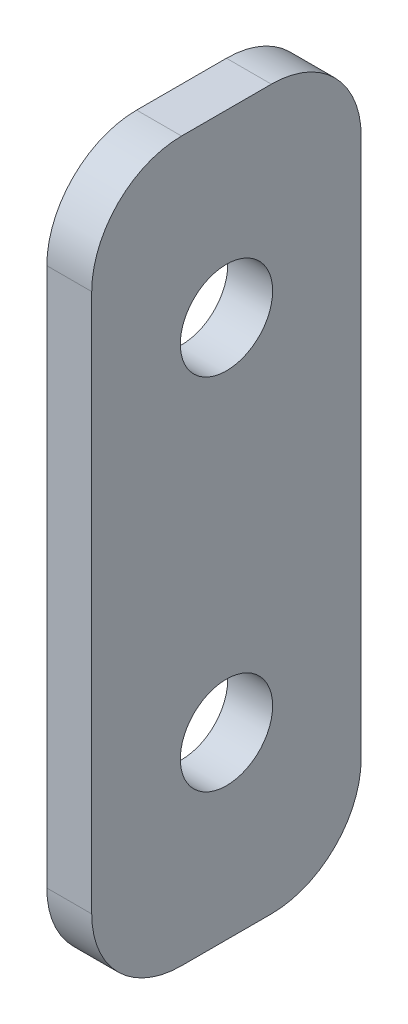
ISO-10303-21;
HEADER;
FILE_DESCRIPTION(('STEP AP214'),'2;1');
FILE_NAME('part.step','',(''),(''),'','','');
FILE_SCHEMA(('AUTOMOTIVE_DESIGN { 1 0 10303 214 1 1 1 1 }'));
ENDSEC;
DATA;
#1=APPLICATION_CONTEXT('core data for automotive mechanical design processes');
#2=APPLICATION_PROTOCOL_DEFINITION('international standard','automotive_design',2000,#1);
#3=PRODUCT_CONTEXT('',#1,'mechanical');
#4=PRODUCT('Part','Part','',(#3));
#5=PRODUCT_RELATED_PRODUCT_CATEGORY('part','',(#4));
#6=PRODUCT_DEFINITION_FORMATION('','',#4);
#7=PRODUCT_DEFINITION_CONTEXT('part definition',#1,'design');
#8=PRODUCT_DEFINITION('design','',#6,#7);
#9=PRODUCT_DEFINITION_SHAPE('','',#8);
#10=(LENGTH_UNIT() NAMED_UNIT(*) SI_UNIT(.MILLI.,.METRE.));
#11=(NAMED_UNIT(*) PLANE_ANGLE_UNIT() SI_UNIT($,.RADIAN.));
#12=(NAMED_UNIT(*) SI_UNIT($,.STERADIAN.) SOLID_ANGLE_UNIT());
#13=UNCERTAINTY_MEASURE_WITH_UNIT(LENGTH_MEASURE(1.E-05),#10,'distance_accuracy_value','');
#14=(GEOMETRIC_REPRESENTATION_CONTEXT(3) GLOBAL_UNCERTAINTY_ASSIGNED_CONTEXT((#13)) GLOBAL_UNIT_ASSIGNED_CONTEXT((#10,
#11,#12)) REPRESENTATION_CONTEXT('',''));
#15=CARTESIAN_POINT('',(0.,0.,0.));
#16=DIRECTION('',(0.,0.,1.));
#17=DIRECTION('',(1.,0.,0.));
#18=AXIS2_PLACEMENT_3D('',#15,#16,#17);
#19=CARTESIAN_POINT('',(1.5875,25.4,-9.525));
#20=DIRECTION('',(0.,0.,1.));
#21=DIRECTION('',(0.,-1.,0.));
#22=AXIS2_PLACEMENT_3D('',#19,#20,#21);
#23=PLANE('',#22);
#24=DIRECTION('',(0.,1.,0.));
#25=VECTOR('',#24,1.);
#26=CARTESIAN_POINT('',(1.5875,25.4,-9.525));
#27=LINE('',#26,#25);
#28=CARTESIAN_POINT('',(1.5875,-19.05,-9.525));
#29=VERTEX_POINT('',#28);
#30=CARTESIAN_POINT('',(1.5875,19.05,-9.525));
#31=VERTEX_POINT('',#30);
#32=EDGE_CURVE('E144',#29,#31,#27,.T.);
#33=ORIENTED_EDGE('',*,*,#32,.F.);
#34=DIRECTION('',(-1.,0.,0.));
#35=VECTOR('',#34,1.);
#36=CARTESIAN_POINT('',(1.5875,-19.05,-9.525));
#37=LINE('',#36,#35);
#38=CARTESIAN_POINT('',(-1.5875,-19.05,-9.525));
#39=VERTEX_POINT('',#38);
#40=EDGE_CURVE('E207',#29,#39,#37,.T.);
#41=ORIENTED_EDGE('',*,*,#40,.T.);
#42=DIRECTION('',(0.,1.,0.));
#43=VECTOR('',#42,1.);
#44=CARTESIAN_POINT('',(-1.5875,25.4,-9.525));
#45=LINE('',#44,#43);
#46=CARTESIAN_POINT('',(-1.5875,19.05,-9.525));
#47=VERTEX_POINT('',#46);
#48=EDGE_CURVE('E221',#39,#47,#45,.T.);
#49=ORIENTED_EDGE('',*,*,#48,.T.);
#50=DIRECTION('',(-1.,0.,0.));
#51=VECTOR('',#50,1.);
#52=CARTESIAN_POINT('',(1.5875,19.05,-9.525));
#53=LINE('',#52,#51);
#54=EDGE_CURVE('E204',#47,#31,#53,.F.);
#55=ORIENTED_EDGE('',*,*,#54,.T.);
#56=EDGE_LOOP('',(#33,#41,#49,#55));
#57=FACE_BOUND('',#56,.T.);
#58=ADVANCED_FACE('F48',(#57),#23,.F.);
#59=CARTESIAN_POINT('',(1.5875,25.4,9.52500000000001));
#60=DIRECTION('',(0.,-1.,0.));
#61=DIRECTION('',(0.,0.,-1.));
#62=AXIS2_PLACEMENT_3D('',#59,#60,#61);
#63=PLANE('',#62);
#64=DIRECTION('',(0.,0.,1.));
#65=VECTOR('',#64,1.);
#66=CARTESIAN_POINT('',(1.5875,25.4,9.52500000000001));
#67=LINE('',#66,#65);
#68=CARTESIAN_POINT('',(1.5875,25.4,-3.17499999999999));
#69=VERTEX_POINT('',#68);
#70=CARTESIAN_POINT('',(1.5875,25.4,3.17500000000001));
#71=VERTEX_POINT('',#70);
#72=EDGE_CURVE('E149',#69,#71,#67,.T.);
#73=ORIENTED_EDGE('',*,*,#72,.F.);
#74=DIRECTION('',(-1.,0.,0.));
#75=VECTOR('',#74,1.);
#76=CARTESIAN_POINT('',(1.5875,25.4,-3.175));
#77=LINE('',#76,#75);
#78=CARTESIAN_POINT('',(-1.5875,25.4,-3.17499999999999));
#79=VERTEX_POINT('',#78);
#80=EDGE_CURVE('E12',#69,#79,#77,.T.);
#81=ORIENTED_EDGE('',*,*,#80,.T.);
#82=DIRECTION('',(0.,0.,1.));
#83=VECTOR('',#82,1.);
#84=CARTESIAN_POINT('',(-1.5875,25.4,9.52500000000001));
#85=LINE('',#84,#83);
#86=CARTESIAN_POINT('',(-1.5875,25.4,3.17500000000001));
#87=VERTEX_POINT('',#86);
#88=EDGE_CURVE('E151',#79,#87,#85,.T.);
#89=ORIENTED_EDGE('',*,*,#88,.T.);
#90=DIRECTION('',(-1.,0.,0.));
#91=VECTOR('',#90,1.);
#92=CARTESIAN_POINT('',(1.5875,25.4,3.175));
#93=LINE('',#92,#91);
#94=EDGE_CURVE('E57',#87,#71,#93,.F.);
#95=ORIENTED_EDGE('',*,*,#94,.T.);
#96=EDGE_LOOP('',(#73,#81,#89,#95));
#97=FACE_BOUND('',#96,.T.);
#98=ADVANCED_FACE('F266',(#97),#63,.F.);
#99=CARTESIAN_POINT('',(1.5875,25.4,9.52500000000001));
#100=DIRECTION('',(0.,0.,-1.));
#101=DIRECTION('',(0.,1.,0.));
#102=AXIS2_PLACEMENT_3D('',#99,#100,#101);
#103=PLANE('',#102);
#104=DIRECTION('',(0.,-1.,0.));
#105=VECTOR('',#104,1.);
#106=CARTESIAN_POINT('',(-1.5875,25.4,9.52500000000001));
#107=LINE('',#106,#105);
#108=CARTESIAN_POINT('',(-1.5875,19.05,9.525));
#109=VERTEX_POINT('',#108);
#110=CARTESIAN_POINT('',(-1.5875,-19.05,9.525));
#111=VERTEX_POINT('',#110);
#112=EDGE_CURVE('E145',#109,#111,#107,.T.);
#113=ORIENTED_EDGE('',*,*,#112,.T.);
#114=DIRECTION('',(-1.,0.,0.));
#115=VECTOR('',#114,1.);
#116=CARTESIAN_POINT('',(1.5875,-19.05,9.525));
#117=LINE('',#116,#115);
#118=CARTESIAN_POINT('',(1.5875,-19.05,9.525));
#119=VERTEX_POINT('',#118);
#120=EDGE_CURVE('E120',#111,#119,#117,.F.);
#121=ORIENTED_EDGE('',*,*,#120,.T.);
#122=DIRECTION('',(0.,-1.,0.));
#123=VECTOR('',#122,1.);
#124=CARTESIAN_POINT('',(1.5875,25.4,9.52500000000001));
#125=LINE('',#124,#123);
#126=CARTESIAN_POINT('',(1.5875,19.05,9.525));
#127=VERTEX_POINT('',#126);
#128=EDGE_CURVE('E185',#127,#119,#125,.T.);
#129=ORIENTED_EDGE('',*,*,#128,.F.);
#130=DIRECTION('',(-1.,0.,0.));
#131=VECTOR('',#130,1.);
#132=CARTESIAN_POINT('',(1.5875,19.05,9.525));
#133=LINE('',#132,#131);
#134=EDGE_CURVE('E126',#127,#109,#133,.T.);
#135=ORIENTED_EDGE('',*,*,#134,.T.);
#136=EDGE_LOOP('',(#113,#121,#129,#135));
#137=FACE_BOUND('',#136,.T.);
#138=ADVANCED_FACE('F271',(#137),#103,.F.);
#139=CARTESIAN_POINT('',(1.5875,-25.4,9.525));
#140=DIRECTION('',(0.,1.,0.));
#141=DIRECTION('',(0.,0.,1.));
#142=AXIS2_PLACEMENT_3D('',#139,#140,#141);
#143=PLANE('',#142);
#144=DIRECTION('',(0.,0.,-1.));
#145=VECTOR('',#144,1.);
#146=CARTESIAN_POINT('',(1.5875,-25.4,9.525));
#147=LINE('',#146,#145);
#148=CARTESIAN_POINT('',(1.5875,-25.4,3.175));
#149=VERTEX_POINT('',#148);
#150=CARTESIAN_POINT('',(1.5875,-25.4,-3.175));
#151=VERTEX_POINT('',#150);
#152=EDGE_CURVE('E136',#149,#151,#147,.T.);
#153=ORIENTED_EDGE('',*,*,#152,.F.);
#154=DIRECTION('',(-1.,0.,0.));
#155=VECTOR('',#154,1.);
#156=CARTESIAN_POINT('',(1.5875,-25.4,3.175));
#157=LINE('',#156,#155);
#158=CARTESIAN_POINT('',(-1.5875,-25.4,3.175));
#159=VERTEX_POINT('',#158);
#160=EDGE_CURVE('E119',#149,#159,#157,.T.);
#161=ORIENTED_EDGE('',*,*,#160,.T.);
#162=DIRECTION('',(0.,0.,-1.));
#163=VECTOR('',#162,1.);
#164=CARTESIAN_POINT('',(-1.5875,-25.4,9.525));
#165=LINE('',#164,#163);
#166=CARTESIAN_POINT('',(-1.5875,-25.4,-3.175));
#167=VERTEX_POINT('',#166);
#168=EDGE_CURVE('E133',#159,#167,#165,.T.);
#169=ORIENTED_EDGE('',*,*,#168,.T.);
#170=DIRECTION('',(-1.,0.,0.));
#171=VECTOR('',#170,1.);
#172=CARTESIAN_POINT('',(1.5875,-25.4,-3.175));
#173=LINE('',#172,#171);
#174=EDGE_CURVE('E139',#167,#151,#173,.F.);
#175=ORIENTED_EDGE('',*,*,#174,.T.);
#176=EDGE_LOOP('',(#153,#161,#169,#175));
#177=FACE_BOUND('',#176,.T.);
#178=ADVANCED_FACE('F132',(#177),#143,.F.);
#179=CARTESIAN_POINT('',(1.5875,0.,0.));
#180=DIRECTION('',(1.,0.,0.));
#181=DIRECTION('',(0.,0.,-1.));
#182=AXIS2_PLACEMENT_3D('',#179,#180,#181);
#183=PLANE('',#182);
#184=CARTESIAN_POINT('',(1.5875,12.7,0.));
#185=DIRECTION('',(1.,0.,0.));
#186=DIRECTION('',(0.,0.,-1.));
#187=AXIS2_PLACEMENT_3D('',#184,#185,#186);
#188=CIRCLE('',#187,3.2639);
#189=CARTESIAN_POINT('',(1.5875,12.7,-3.2639));
#190=VERTEX_POINT('',#189);
#191=EDGE_CURVE('E240',#190,#190,#188,.T.);
#192=ORIENTED_EDGE('',*,*,#191,.F.);
#193=EDGE_LOOP('',(#192));
#194=FACE_BOUND('',#193,.T.);
#195=CARTESIAN_POINT('',(1.5875,-12.7,0.));
#196=DIRECTION('',(1.,0.,0.));
#197=DIRECTION('',(0.,0.,-1.));
#198=AXIS2_PLACEMENT_3D('',#195,#196,#197);
#199=CIRCLE('',#198,3.2639);
#200=CARTESIAN_POINT('',(1.5875,-12.7,-3.2639));
#201=VERTEX_POINT('',#200);
#202=EDGE_CURVE('E229',#201,#201,#199,.T.);
#203=ORIENTED_EDGE('',*,*,#202,.F.);
#204=EDGE_LOOP('',(#203));
#205=FACE_BOUND('',#204,.T.);
#206=ORIENTED_EDGE('',*,*,#128,.T.);
#207=CARTESIAN_POINT('',(1.5875,-19.05,3.175));
#208=DIRECTION('',(1.,0.,0.));
#209=DIRECTION('',(0.,0.,-1.));
#210=AXIS2_PLACEMENT_3D('',#207,#208,#209);
#211=CIRCLE('',#210,6.35);
#212=EDGE_CURVE('E200',#119,#149,#211,.T.);
#213=ORIENTED_EDGE('',*,*,#212,.T.);
#214=ORIENTED_EDGE('',*,*,#152,.T.);
#215=CARTESIAN_POINT('',(1.5875,-19.05,-3.175));
#216=DIRECTION('',(1.,0.,0.));
#217=DIRECTION('',(0.,0.,-1.));
#218=AXIS2_PLACEMENT_3D('',#215,#216,#217);
#219=CIRCLE('',#218,6.35);
#220=EDGE_CURVE('E175',#151,#29,#219,.T.);
#221=ORIENTED_EDGE('',*,*,#220,.T.);
#222=ORIENTED_EDGE('',*,*,#32,.T.);
#223=CARTESIAN_POINT('',(1.5875,19.05,-3.175));
#224=DIRECTION('',(1.,0.,0.));
#225=DIRECTION('',(0.,0.,-1.));
#226=AXIS2_PLACEMENT_3D('',#223,#224,#225);
#227=CIRCLE('',#226,6.35);
#228=EDGE_CURVE('E70',#31,#69,#227,.T.);
#229=ORIENTED_EDGE('',*,*,#228,.T.);
#230=ORIENTED_EDGE('',*,*,#72,.T.);
#231=CARTESIAN_POINT('',(1.5875,19.05,3.175));
#232=DIRECTION('',(1.,0.,0.));
#233=DIRECTION('',(0.,0.,-1.));
#234=AXIS2_PLACEMENT_3D('',#231,#232,#233);
#235=CIRCLE('',#234,6.35);
#236=EDGE_CURVE('E168',#71,#127,#235,.T.);
#237=ORIENTED_EDGE('',*,*,#236,.T.);
#238=EDGE_LOOP('',(#206,#213,#214,#221,#222,#229,#230,#237));
#239=FACE_BOUND('',#238,.T.);
#240=ADVANCED_FACE('F214',(#194,#205,#239),#183,.T.);
#241=CARTESIAN_POINT('',(-1.5875,0.,0.));
#242=DIRECTION('',(1.,0.,0.));
#243=DIRECTION('',(0.,0.,-1.));
#244=AXIS2_PLACEMENT_3D('',#241,#242,#243);
#245=PLANE('',#244);
#246=CARTESIAN_POINT('',(-1.5875,12.7,0.));
#247=DIRECTION('',(1.,0.,0.));
#248=DIRECTION('',(0.,0.,-1.));
#249=AXIS2_PLACEMENT_3D('',#246,#247,#248);
#250=CIRCLE('',#249,3.2639);
#251=CARTESIAN_POINT('',(-1.5875,12.7,-3.2639));
#252=VERTEX_POINT('',#251);
#253=EDGE_CURVE('E234',#252,#252,#250,.T.);
#254=ORIENTED_EDGE('',*,*,#253,.T.);
#255=EDGE_LOOP('',(#254));
#256=FACE_BOUND('',#255,.T.);
#257=CARTESIAN_POINT('',(-1.5875,-12.7,0.));
#258=DIRECTION('',(1.,0.,0.));
#259=DIRECTION('',(0.,0.,-1.));
#260=AXIS2_PLACEMENT_3D('',#257,#258,#259);
#261=CIRCLE('',#260,3.2639);
#262=CARTESIAN_POINT('',(-1.5875,-12.7,-3.2639));
#263=VERTEX_POINT('',#262);
#264=EDGE_CURVE('E225',#263,#263,#261,.T.);
#265=ORIENTED_EDGE('',*,*,#264,.T.);
#266=EDGE_LOOP('',(#265));
#267=FACE_BOUND('',#266,.T.);
#268=ORIENTED_EDGE('',*,*,#168,.F.);
#269=CARTESIAN_POINT('',(-1.5875,-19.05,3.175));
#270=DIRECTION('',(1.,0.,0.));
#271=DIRECTION('',(0.,0.,-1.));
#272=AXIS2_PLACEMENT_3D('',#269,#270,#271);
#273=CIRCLE('',#272,6.35);
#274=EDGE_CURVE('E115',#159,#111,#273,.F.);
#275=ORIENTED_EDGE('',*,*,#274,.T.);
#276=ORIENTED_EDGE('',*,*,#112,.F.);
#277=CARTESIAN_POINT('',(-1.5875,19.05,3.175));
#278=DIRECTION('',(1.,0.,0.));
#279=DIRECTION('',(0.,0.,-1.));
#280=AXIS2_PLACEMENT_3D('',#277,#278,#279);
#281=CIRCLE('',#280,6.35);
#282=EDGE_CURVE('E138',#109,#87,#281,.F.);
#283=ORIENTED_EDGE('',*,*,#282,.T.);
#284=ORIENTED_EDGE('',*,*,#88,.F.);
#285=CARTESIAN_POINT('',(-1.5875,19.05,-3.175));
#286=DIRECTION('',(1.,0.,0.));
#287=DIRECTION('',(0.,0.,-1.));
#288=AXIS2_PLACEMENT_3D('',#285,#286,#287);
#289=CIRCLE('',#288,6.35);
#290=EDGE_CURVE('E159',#79,#47,#289,.F.);
#291=ORIENTED_EDGE('',*,*,#290,.T.);
#292=ORIENTED_EDGE('',*,*,#48,.F.);
#293=CARTESIAN_POINT('',(-1.5875,-19.05,-3.175));
#294=DIRECTION('',(1.,0.,0.));
#295=DIRECTION('',(0.,0.,-1.));
#296=AXIS2_PLACEMENT_3D('',#293,#294,#295);
#297=CIRCLE('',#296,6.35);
#298=EDGE_CURVE('E127',#39,#167,#297,.F.);
#299=ORIENTED_EDGE('',*,*,#298,.T.);
#300=EDGE_LOOP('',(#268,#275,#276,#283,#284,#291,#292,#299));
#301=FACE_BOUND('',#300,.T.);
#302=ADVANCED_FACE('F141',(#256,#267,#301),#245,.F.);
#303=CARTESIAN_POINT('',(1.5875,-12.7,0.));
#304=DIRECTION('',(1.,0.,0.));
#305=DIRECTION('',(0.,0.,-1.));
#306=AXIS2_PLACEMENT_3D('',#303,#304,#305);
#307=CYLINDRICAL_SURFACE('',#306,3.2639);
#308=ORIENTED_EDGE('',*,*,#264,.F.);
#309=EDGE_LOOP('',(#308));
#310=FACE_BOUND('',#309,.T.);
#311=ORIENTED_EDGE('',*,*,#202,.T.);
#312=EDGE_LOOP('',(#311));
#313=FACE_BOUND('',#312,.T.);
#314=ADVANCED_FACE('F253',(#310,#313),#307,.F.);
#315=CARTESIAN_POINT('',(1.5875,12.7,0.));
#316=DIRECTION('',(1.,0.,0.));
#317=DIRECTION('',(0.,0.,-1.));
#318=AXIS2_PLACEMENT_3D('',#315,#316,#317);
#319=CYLINDRICAL_SURFACE('',#318,3.2639);
#320=ORIENTED_EDGE('',*,*,#253,.F.);
#321=EDGE_LOOP('',(#320));
#322=FACE_BOUND('',#321,.T.);
#323=ORIENTED_EDGE('',*,*,#191,.T.);
#324=EDGE_LOOP('',(#323));
#325=FACE_BOUND('',#324,.T.);
#326=ADVANCED_FACE('F246',(#322,#325),#319,.F.);
#327=CARTESIAN_POINT('',(1.5875,-19.05,3.175));
#328=DIRECTION('',(-1.,0.,0.));
#329=DIRECTION('',(0.,0.,1.));
#330=AXIS2_PLACEMENT_3D('',#327,#328,#329);
#331=CYLINDRICAL_SURFACE('',#330,6.35);
#332=ORIENTED_EDGE('',*,*,#212,.F.);
#333=ORIENTED_EDGE('',*,*,#120,.F.);
#334=ORIENTED_EDGE('',*,*,#274,.F.);
#335=ORIENTED_EDGE('',*,*,#160,.F.);
#336=EDGE_LOOP('',(#332,#333,#334,#335));
#337=FACE_BOUND('',#336,.T.);
#338=ADVANCED_FACE('F118',(#337),#331,.T.);
#339=CARTESIAN_POINT('',(1.5875,-19.05,-3.175));
#340=DIRECTION('',(-1.,0.,0.));
#341=DIRECTION('',(0.,0.,1.));
#342=AXIS2_PLACEMENT_3D('',#339,#340,#341);
#343=CYLINDRICAL_SURFACE('',#342,6.35);
#344=ORIENTED_EDGE('',*,*,#220,.F.);
#345=ORIENTED_EDGE('',*,*,#174,.F.);
#346=ORIENTED_EDGE('',*,*,#298,.F.);
#347=ORIENTED_EDGE('',*,*,#40,.F.);
#348=EDGE_LOOP('',(#344,#345,#346,#347));
#349=FACE_BOUND('',#348,.T.);
#350=ADVANCED_FACE('F218',(#349),#343,.T.);
#351=CARTESIAN_POINT('',(1.5875,19.05,-3.175));
#352=DIRECTION('',(-1.,0.,0.));
#353=DIRECTION('',(0.,0.,1.));
#354=AXIS2_PLACEMENT_3D('',#351,#352,#353);
#355=CYLINDRICAL_SURFACE('',#354,6.35);
#356=ORIENTED_EDGE('',*,*,#228,.F.);
#357=ORIENTED_EDGE('',*,*,#54,.F.);
#358=ORIENTED_EDGE('',*,*,#290,.F.);
#359=ORIENTED_EDGE('',*,*,#80,.F.);
#360=EDGE_LOOP('',(#356,#357,#358,#359));
#361=FACE_BOUND('',#360,.T.);
#362=ADVANCED_FACE('F278',(#361),#355,.T.);
#363=CARTESIAN_POINT('',(1.5875,19.05,3.175));
#364=DIRECTION('',(-1.,0.,0.));
#365=DIRECTION('',(0.,0.,1.));
#366=AXIS2_PLACEMENT_3D('',#363,#364,#365);
#367=CYLINDRICAL_SURFACE('',#366,6.35);
#368=ORIENTED_EDGE('',*,*,#236,.F.);
#369=ORIENTED_EDGE('',*,*,#94,.F.);
#370=ORIENTED_EDGE('',*,*,#282,.F.);
#371=ORIENTED_EDGE('',*,*,#134,.F.);
#372=EDGE_LOOP('',(#368,#369,#370,#371));
#373=FACE_BOUND('',#372,.T.);
#374=ADVANCED_FACE('F50',(#373),#367,.T.);
#375=CLOSED_SHELL('',(#58,#98,#138,#178,#240,#302,#314,#326,#338,#350,#362,#374));
#376=MANIFOLD_SOLID_BREP('B2',#375);
#377=ADVANCED_BREP_SHAPE_REPRESENTATION('',(#18,#376),#14);
#378=SHAPE_DEFINITION_REPRESENTATION(#9,#377);
ENDSEC;
END-ISO-10303-21;
